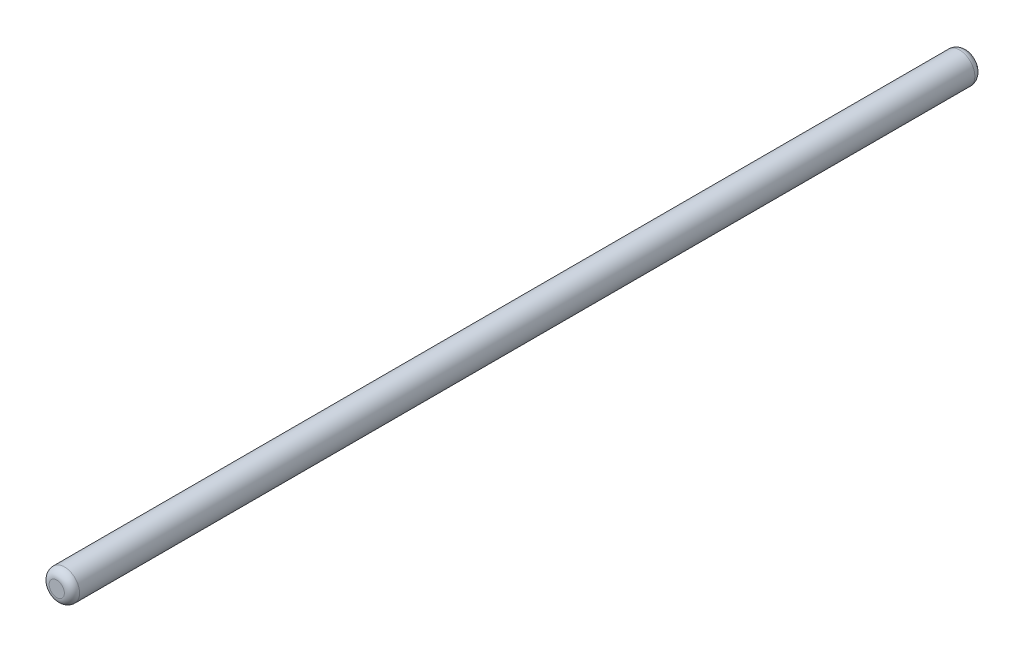
ISO-10303-21;
HEADER;
FILE_DESCRIPTION(('STEP AP214'),'2;1');
FILE_NAME('part.step','',(''),(''),'','','');
FILE_SCHEMA(('AUTOMOTIVE_DESIGN { 1 0 10303 214 1 1 1 1 }'));
ENDSEC;
DATA;
#1=APPLICATION_CONTEXT('core data for automotive mechanical design processes');
#2=APPLICATION_PROTOCOL_DEFINITION('international standard','automotive_design',2000,#1);
#3=PRODUCT_CONTEXT('',#1,'mechanical');
#4=PRODUCT('Part','Part','',(#3));
#5=PRODUCT_RELATED_PRODUCT_CATEGORY('part','',(#4));
#6=PRODUCT_DEFINITION_FORMATION('','',#4);
#7=PRODUCT_DEFINITION_CONTEXT('part definition',#1,'design');
#8=PRODUCT_DEFINITION('design','',#6,#7);
#9=PRODUCT_DEFINITION_SHAPE('','',#8);
#10=(LENGTH_UNIT() NAMED_UNIT(*) SI_UNIT(.MILLI.,.METRE.));
#11=(NAMED_UNIT(*) PLANE_ANGLE_UNIT() SI_UNIT($,.RADIAN.));
#12=(NAMED_UNIT(*) SI_UNIT($,.STERADIAN.) SOLID_ANGLE_UNIT());
#13=UNCERTAINTY_MEASURE_WITH_UNIT(LENGTH_MEASURE(1.E-05),#10,'distance_accuracy_value','');
#14=(GEOMETRIC_REPRESENTATION_CONTEXT(3) GLOBAL_UNCERTAINTY_ASSIGNED_CONTEXT((#13)) GLOBAL_UNIT_ASSIGNED_CONTEXT((#10,
#11,#12)) REPRESENTATION_CONTEXT('',''));
#15=CARTESIAN_POINT('',(0.,0.,0.));
#16=DIRECTION('',(0.,0.,1.));
#17=DIRECTION('',(1.,0.,0.));
#18=AXIS2_PLACEMENT_3D('',#15,#16,#17);
#19=CARTESIAN_POINT('',(0.,0.,239.));
#20=DIRECTION('',(0.,0.,-1.));
#21=DIRECTION('',(-1.,0.,0.));
#22=AXIS2_PLACEMENT_3D('',#19,#20,#21);
#23=CYLINDRICAL_SURFACE('',#22,4.);
#24=CARTESIAN_POINT('',(0.,0.,237.));
#25=DIRECTION('',(0.,0.,1.));
#26=DIRECTION('',(1.,0.,0.));
#27=AXIS2_PLACEMENT_3D('',#24,#25,#26);
#28=CIRCLE('',#27,4.);
#29=CARTESIAN_POINT('',(4.,0.,237.));
#30=VERTEX_POINT('',#29);
#31=EDGE_CURVE('E49',#30,#30,#28,.F.);
#32=ORIENTED_EDGE('',*,*,#31,.T.);
#33=EDGE_LOOP('',(#32));
#34=FACE_BOUND('',#33,.T.);
#35=CARTESIAN_POINT('',(0.,0.,2.));
#36=DIRECTION('',(0.,0.,1.));
#37=DIRECTION('',(1.,0.,0.));
#38=AXIS2_PLACEMENT_3D('',#35,#36,#37);
#39=CIRCLE('',#38,4.);
#40=CARTESIAN_POINT('',(4.,0.,2.));
#41=VERTEX_POINT('',#40);
#42=EDGE_CURVE('E54',#41,#41,#39,.T.);
#43=ORIENTED_EDGE('',*,*,#42,.T.);
#44=EDGE_LOOP('',(#43));
#45=FACE_BOUND('',#44,.T.);
#46=ADVANCED_FACE('F41',(#34,#45),#23,.T.);
#47=CARTESIAN_POINT('',(0.,0.,239.));
#48=DIRECTION('',(0.,0.,1.));
#49=DIRECTION('',(1.,0.,0.));
#50=AXIS2_PLACEMENT_3D('',#47,#48,#49);
#51=PLANE('',#50);
#52=CARTESIAN_POINT('',(0.,0.,239.));
#53=DIRECTION('',(0.,0.,1.));
#54=DIRECTION('',(1.,0.,0.));
#55=AXIS2_PLACEMENT_3D('',#52,#53,#54);
#56=CIRCLE('',#55,2.);
#57=CARTESIAN_POINT('',(2.,0.,239.));
#58=VERTEX_POINT('',#57);
#59=EDGE_CURVE('E59',#58,#58,#56,.T.);
#60=ORIENTED_EDGE('',*,*,#59,.T.);
#61=EDGE_LOOP('',(#60));
#62=FACE_BOUND('',#61,.T.);
#63=ADVANCED_FACE('F66',(#62),#51,.T.);
#64=CARTESIAN_POINT('',(0.,0.,0.));
#65=DIRECTION('',(0.,0.,1.));
#66=DIRECTION('',(1.,0.,0.));
#67=AXIS2_PLACEMENT_3D('',#64,#65,#66);
#68=PLANE('',#67);
#69=CARTESIAN_POINT('',(0.,0.,0.));
#70=DIRECTION('',(0.,0.,1.));
#71=DIRECTION('',(1.,0.,0.));
#72=AXIS2_PLACEMENT_3D('',#69,#70,#71);
#73=CIRCLE('',#72,2.);
#74=CARTESIAN_POINT('',(2.,0.,0.));
#75=VERTEX_POINT('',#74);
#76=EDGE_CURVE('E10',#75,#75,#73,.F.);
#77=ORIENTED_EDGE('',*,*,#76,.T.);
#78=EDGE_LOOP('',(#77));
#79=FACE_BOUND('',#78,.T.);
#80=ADVANCED_FACE('F70',(#79),#68,.F.);
#81=CARTESIAN_POINT('',(0.,0.,237.));
#82=DIRECTION('',(0.,0.,1.));
#83=DIRECTION('',(1.,0.,0.));
#84=AXIS2_PLACEMENT_3D('',#81,#82,#83);
#85=DEGENERATE_TOROIDAL_SURFACE('',#84,2.,2.,.T.);
#86=ORIENTED_EDGE('',*,*,#31,.F.);
#87=EDGE_LOOP('',(#86));
#88=FACE_BOUND('',#87,.T.);
#89=ORIENTED_EDGE('',*,*,#59,.F.);
#90=EDGE_LOOP('',(#89));
#91=FACE_BOUND('',#90,.T.);
#92=ADVANCED_FACE('F68',(#88,#91),#85,.T.);
#93=CARTESIAN_POINT('',(0.,0.,2.));
#94=DIRECTION('',(0.,0.,1.));
#95=DIRECTION('',(1.,0.,0.));
#96=AXIS2_PLACEMENT_3D('',#93,#94,#95);
#97=DEGENERATE_TOROIDAL_SURFACE('',#96,2.,2.,.T.);
#98=ORIENTED_EDGE('',*,*,#76,.F.);
#99=EDGE_LOOP('',(#98));
#100=FACE_BOUND('',#99,.T.);
#101=ORIENTED_EDGE('',*,*,#42,.F.);
#102=EDGE_LOOP('',(#101));
#103=FACE_BOUND('',#102,.T.);
#104=ADVANCED_FACE('F43',(#100,#103),#97,.T.);
#105=CLOSED_SHELL('',(#46,#63,#80,#92,#104));
#106=MANIFOLD_SOLID_BREP('B2',#105);
#107=ADVANCED_BREP_SHAPE_REPRESENTATION('',(#18,#106),#14);
#108=SHAPE_DEFINITION_REPRESENTATION(#9,#107);
ENDSEC;
END-ISO-10303-21;
